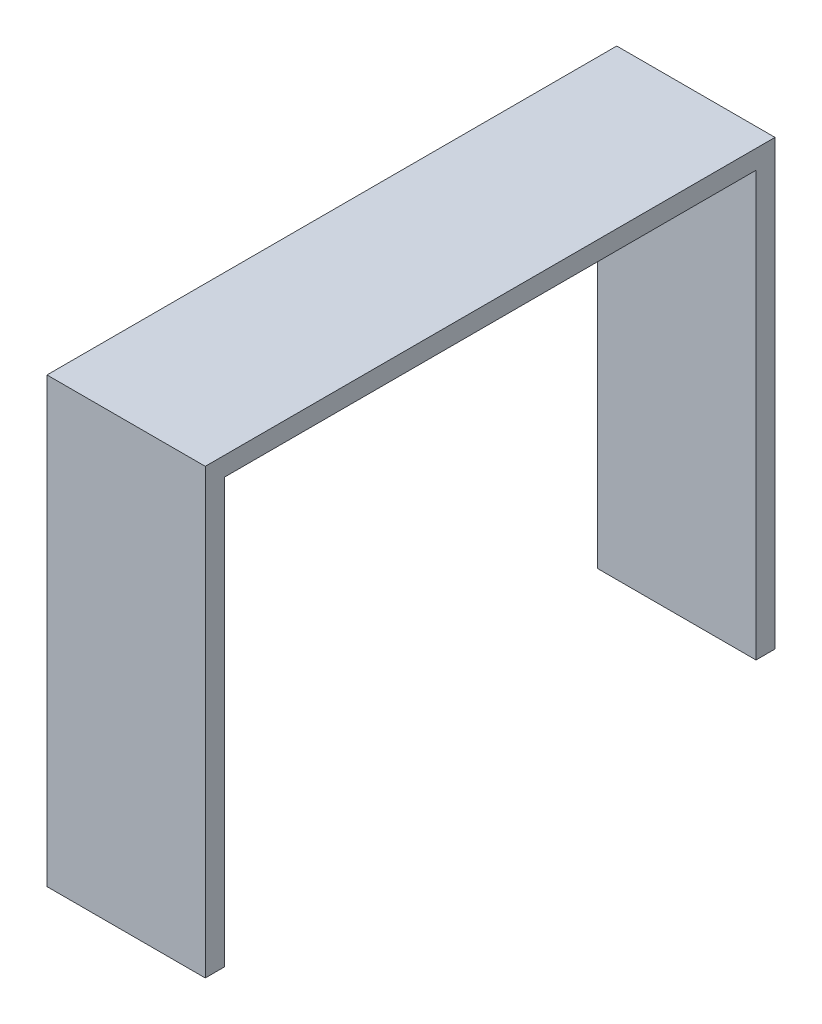
ISO-10303-21;
HEADER;
FILE_DESCRIPTION(('STEP AP214'),'2;1');
FILE_NAME('part.step','',(''),(''),'','','');
FILE_SCHEMA(('AUTOMOTIVE_DESIGN { 1 0 10303 214 1 1 1 1 }'));
ENDSEC;
DATA;
#1=APPLICATION_CONTEXT('core data for automotive mechanical design processes');
#2=APPLICATION_PROTOCOL_DEFINITION('international standard','automotive_design',2000,#1);
#3=PRODUCT_CONTEXT('',#1,'mechanical');
#4=PRODUCT('Part','Part','',(#3));
#5=PRODUCT_RELATED_PRODUCT_CATEGORY('part','',(#4));
#6=PRODUCT_DEFINITION_FORMATION('','',#4);
#7=PRODUCT_DEFINITION_CONTEXT('part definition',#1,'design');
#8=PRODUCT_DEFINITION('design','',#6,#7);
#9=PRODUCT_DEFINITION_SHAPE('','',#8);
#10=(LENGTH_UNIT() NAMED_UNIT(*) SI_UNIT(.MILLI.,.METRE.));
#11=(NAMED_UNIT(*) PLANE_ANGLE_UNIT() SI_UNIT($,.RADIAN.));
#12=(NAMED_UNIT(*) SI_UNIT($,.STERADIAN.) SOLID_ANGLE_UNIT());
#13=UNCERTAINTY_MEASURE_WITH_UNIT(LENGTH_MEASURE(1.E-05),#10,'distance_accuracy_value','');
#14=(GEOMETRIC_REPRESENTATION_CONTEXT(3) GLOBAL_UNCERTAINTY_ASSIGNED_CONTEXT((#13)) GLOBAL_UNIT_ASSIGNED_CONTEXT((#10,
#11,#12)) REPRESENTATION_CONTEXT('',''));
#15=CARTESIAN_POINT('',(0.,0.,0.));
#16=DIRECTION('',(0.,0.,1.));
#17=DIRECTION('',(1.,0.,0.));
#18=AXIS2_PLACEMENT_3D('',#15,#16,#17);
#19=CARTESIAN_POINT('',(23.7086266927991,74.,-5.));
#20=DIRECTION('',(1.,0.,0.));
#21=DIRECTION('',(0.,0.,-1.));
#22=AXIS2_PLACEMENT_3D('',#19,#20,#21);
#23=PLANE('',#22);
#24=DIRECTION('',(0.,0.,1.));
#25=VECTOR('',#24,1.);
#26=CARTESIAN_POINT('',(23.7086266927991,4.,-5.));
#27=LINE('',#26,#25);
#28=CARTESIAN_POINT('',(23.7086266927991,4.,-8.00000000000001));
#29=VERTEX_POINT('',#28);
#30=CARTESIAN_POINT('',(23.7086266927991,4.,-5.));
#31=VERTEX_POINT('',#30);
#32=EDGE_CURVE('E11',#29,#31,#27,.T.);
#33=ORIENTED_EDGE('',*,*,#32,.T.);
#34=DIRECTION('',(0.,-1.,0.));
#35=VECTOR('',#34,1.);
#36=CARTESIAN_POINT('',(23.7086266927991,74.,-5.));
#37=LINE('',#36,#35);
#38=CARTESIAN_POINT('',(23.7086266927991,74.,-5.));
#39=VERTEX_POINT('',#38);
#40=EDGE_CURVE('E160',#39,#31,#37,.T.);
#41=ORIENTED_EDGE('',*,*,#40,.F.);
#42=DIRECTION('',(0.,0.,1.));
#43=VECTOR('',#42,1.);
#44=CARTESIAN_POINT('',(23.7086266927991,74.,-5.));
#45=LINE('',#44,#43);
#46=CARTESIAN_POINT('',(23.7086266927991,74.,-95.));
#47=VERTEX_POINT('',#46);
#48=EDGE_CURVE('E43',#47,#39,#45,.T.);
#49=ORIENTED_EDGE('',*,*,#48,.F.);
#50=DIRECTION('',(0.,-1.,0.));
#51=VECTOR('',#50,1.);
#52=CARTESIAN_POINT('',(23.7086266927991,74.,-95.));
#53=LINE('',#52,#51);
#54=CARTESIAN_POINT('',(23.7086266927991,4.,-95.));
#55=VERTEX_POINT('',#54);
#56=EDGE_CURVE('E133',#47,#55,#53,.T.);
#57=ORIENTED_EDGE('',*,*,#56,.T.);
#58=DIRECTION('',(0.,0.,1.));
#59=VECTOR('',#58,1.);
#60=CARTESIAN_POINT('',(23.7086266927991,4.,-95.));
#61=LINE('',#60,#59);
#62=CARTESIAN_POINT('',(23.7086266927991,4.,-92.));
#63=VERTEX_POINT('',#62);
#64=EDGE_CURVE('E142',#55,#63,#61,.T.);
#65=ORIENTED_EDGE('',*,*,#64,.T.);
#66=DIRECTION('',(0.,-1.,0.));
#67=VECTOR('',#66,1.);
#68=CARTESIAN_POINT('',(23.7086266927991,74.,-92.));
#69=LINE('',#68,#67);
#70=CARTESIAN_POINT('',(23.7086266927991,71.,-92.));
#71=VERTEX_POINT('',#70);
#72=EDGE_CURVE('E150',#71,#63,#69,.T.);
#73=ORIENTED_EDGE('',*,*,#72,.F.);
#74=DIRECTION('',(0.,0.,-1.));
#75=VECTOR('',#74,1.);
#76=CARTESIAN_POINT('',(23.7086266927992,71.,-4.998));
#77=LINE('',#76,#75);
#78=CARTESIAN_POINT('',(23.7086266927992,71.,-8.00000000000001));
#79=VERTEX_POINT('',#78);
#80=EDGE_CURVE('E154',#79,#71,#77,.T.);
#81=ORIENTED_EDGE('',*,*,#80,.F.);
#82=DIRECTION('',(0.,-1.,0.));
#83=VECTOR('',#82,1.);
#84=CARTESIAN_POINT('',(23.7086266927991,74.,-8.00000000000001));
#85=LINE('',#84,#83);
#86=EDGE_CURVE('E85',#79,#29,#85,.T.);
#87=ORIENTED_EDGE('',*,*,#86,.T.);
#88=EDGE_LOOP('',(#33,#41,#49,#57,#65,#73,#81,#87));
#89=FACE_BOUND('',#88,.T.);
#90=ADVANCED_FACE('F39',(#89),#23,.F.);
#91=CARTESIAN_POINT('',(23.7086266927991,74.,-5.));
#92=DIRECTION('',(0.,0.,-1.));
#93=DIRECTION('',(-1.,0.,0.));
#94=AXIS2_PLACEMENT_3D('',#91,#92,#93);
#95=PLANE('',#94);
#96=DIRECTION('',(1.,0.,0.));
#97=VECTOR('',#96,1.);
#98=CARTESIAN_POINT('',(23.7086266927991,4.,-5.));
#99=LINE('',#98,#97);
#100=CARTESIAN_POINT('',(48.7086266927992,4.,-5.));
#101=VERTEX_POINT('',#100);
#102=EDGE_CURVE('E48',#31,#101,#99,.T.);
#103=ORIENTED_EDGE('',*,*,#102,.T.);
#104=DIRECTION('',(0.,-1.,0.));
#105=VECTOR('',#104,1.);
#106=CARTESIAN_POINT('',(48.7086266927992,74.,-5.));
#107=LINE('',#106,#105);
#108=CARTESIAN_POINT('',(48.7086266927992,74.,-5.));
#109=VERTEX_POINT('',#108);
#110=EDGE_CURVE('E162',#109,#101,#107,.T.);
#111=ORIENTED_EDGE('',*,*,#110,.F.);
#112=DIRECTION('',(1.,0.,0.));
#113=VECTOR('',#112,1.);
#114=CARTESIAN_POINT('',(23.7086266927991,74.,-5.));
#115=LINE('',#114,#113);
#116=EDGE_CURVE('E78',#39,#109,#115,.T.);
#117=ORIENTED_EDGE('',*,*,#116,.F.);
#118=ORIENTED_EDGE('',*,*,#40,.T.);
#119=EDGE_LOOP('',(#103,#111,#117,#118));
#120=FACE_BOUND('',#119,.T.);
#121=ADVANCED_FACE('F172',(#120),#95,.F.);
#122=CARTESIAN_POINT('',(48.7086266927992,74.,-5.));
#123=DIRECTION('',(-1.,0.,0.));
#124=DIRECTION('',(0.,0.,1.));
#125=AXIS2_PLACEMENT_3D('',#122,#123,#124);
#126=PLANE('',#125);
#127=DIRECTION('',(0.,0.,-1.));
#128=VECTOR('',#127,1.);
#129=CARTESIAN_POINT('',(48.7086266927992,4.,-5.));
#130=LINE('',#129,#128);
#131=CARTESIAN_POINT('',(48.7086266927992,4.,-8.00000000000002));
#132=VERTEX_POINT('',#131);
#133=EDGE_CURVE('E169',#101,#132,#130,.T.);
#134=ORIENTED_EDGE('',*,*,#133,.T.);
#135=DIRECTION('',(0.,-1.,0.));
#136=VECTOR('',#135,1.);
#137=CARTESIAN_POINT('',(48.7086266927992,74.,-8.00000000000002));
#138=LINE('',#137,#136);
#139=CARTESIAN_POINT('',(48.7086266927992,71.,-8.00000000000002));
#140=VERTEX_POINT('',#139);
#141=EDGE_CURVE('E164',#140,#132,#138,.T.);
#142=ORIENTED_EDGE('',*,*,#141,.F.);
#143=DIRECTION('',(0.,0.,-1.));
#144=VECTOR('',#143,1.);
#145=CARTESIAN_POINT('',(48.7086266927992,71.,-4.998));
#146=LINE('',#145,#144);
#147=CARTESIAN_POINT('',(48.7086266927992,71.,-92.));
#148=VERTEX_POINT('',#147);
#149=EDGE_CURVE('E56',#140,#148,#146,.T.);
#150=ORIENTED_EDGE('',*,*,#149,.T.);
#151=DIRECTION('',(0.,-1.,0.));
#152=VECTOR('',#151,1.);
#153=CARTESIAN_POINT('',(48.7086266927992,74.,-92.));
#154=LINE('',#153,#152);
#155=CARTESIAN_POINT('',(48.7086266927992,4.,-92.));
#156=VERTEX_POINT('',#155);
#157=EDGE_CURVE('E132',#148,#156,#154,.T.);
#158=ORIENTED_EDGE('',*,*,#157,.T.);
#159=DIRECTION('',(0.,0.,-1.));
#160=VECTOR('',#159,1.);
#161=CARTESIAN_POINT('',(48.7086266927992,4.,-95.));
#162=LINE('',#161,#160);
#163=CARTESIAN_POINT('',(48.7086266927992,4.,-95.));
#164=VERTEX_POINT('',#163);
#165=EDGE_CURVE('E129',#156,#164,#162,.T.);
#166=ORIENTED_EDGE('',*,*,#165,.T.);
#167=DIRECTION('',(0.,-1.,0.));
#168=VECTOR('',#167,1.);
#169=CARTESIAN_POINT('',(48.7086266927992,74.,-95.));
#170=LINE('',#169,#168);
#171=CARTESIAN_POINT('',(48.7086266927992,74.,-95.));
#172=VERTEX_POINT('',#171);
#173=EDGE_CURVE('E125',#172,#164,#170,.T.);
#174=ORIENTED_EDGE('',*,*,#173,.F.);
#175=DIRECTION('',(0.,0.,-1.));
#176=VECTOR('',#175,1.);
#177=CARTESIAN_POINT('',(48.7086266927992,74.,-5.));
#178=LINE('',#177,#176);
#179=EDGE_CURVE('E116',#109,#172,#178,.T.);
#180=ORIENTED_EDGE('',*,*,#179,.F.);
#181=ORIENTED_EDGE('',*,*,#110,.T.);
#182=EDGE_LOOP('',(#134,#142,#150,#158,#166,#174,#180,#181));
#183=FACE_BOUND('',#182,.T.);
#184=ADVANCED_FACE('F127',(#183),#126,.F.);
#185=CARTESIAN_POINT('',(23.7086266927991,74.,-8.00000000000001));
#186=DIRECTION('',(0.,0.,1.));
#187=DIRECTION('',(1.,0.,0.));
#188=AXIS2_PLACEMENT_3D('',#185,#186,#187);
#189=PLANE('',#188);
#190=ORIENTED_EDGE('',*,*,#86,.F.);
#191=DIRECTION('',(1.,0.,0.));
#192=VECTOR('',#191,1.);
#193=CARTESIAN_POINT('',(23.7086266927992,71.,-8.00000000000001));
#194=LINE('',#193,#192);
#195=EDGE_CURVE('E157',#79,#140,#194,.T.);
#196=ORIENTED_EDGE('',*,*,#195,.T.);
#197=ORIENTED_EDGE('',*,*,#141,.T.);
#198=DIRECTION('',(-1.,0.,0.));
#199=VECTOR('',#198,1.);
#200=CARTESIAN_POINT('',(23.7086266927991,4.,-8.00000000000001));
#201=LINE('',#200,#199);
#202=EDGE_CURVE('E167',#132,#29,#201,.T.);
#203=ORIENTED_EDGE('',*,*,#202,.T.);
#204=EDGE_LOOP('',(#190,#196,#197,#203));
#205=FACE_BOUND('',#204,.T.);
#206=ADVANCED_FACE('F177',(#205),#189,.F.);
#207=CARTESIAN_POINT('',(0.,74.,0.));
#208=DIRECTION('',(0.,-1.,0.));
#209=DIRECTION('',(0.,0.,-1.));
#210=AXIS2_PLACEMENT_3D('',#207,#208,#209);
#211=PLANE('',#210);
#212=ORIENTED_EDGE('',*,*,#48,.T.);
#213=ORIENTED_EDGE('',*,*,#116,.T.);
#214=ORIENTED_EDGE('',*,*,#179,.T.);
#215=DIRECTION('',(-1.,0.,0.));
#216=VECTOR('',#215,1.);
#217=CARTESIAN_POINT('',(23.7086266927991,74.,-95.));
#218=LINE('',#217,#216);
#219=EDGE_CURVE('E119',#172,#47,#218,.T.);
#220=ORIENTED_EDGE('',*,*,#219,.T.);
#221=EDGE_LOOP('',(#212,#213,#214,#220));
#222=FACE_BOUND('',#221,.T.);
#223=ADVANCED_FACE('F41',(#222),#211,.F.);
#224=CARTESIAN_POINT('',(0.,4.,0.));
#225=DIRECTION('',(0.,-1.,0.));
#226=DIRECTION('',(0.,0.,-1.));
#227=AXIS2_PLACEMENT_3D('',#224,#225,#226);
#228=PLANE('',#227);
#229=ORIENTED_EDGE('',*,*,#32,.F.);
#230=ORIENTED_EDGE('',*,*,#202,.F.);
#231=ORIENTED_EDGE('',*,*,#133,.F.);
#232=ORIENTED_EDGE('',*,*,#102,.F.);
#233=EDGE_LOOP('',(#229,#230,#231,#232));
#234=FACE_BOUND('',#233,.T.);
#235=ADVANCED_FACE('F175',(#234),#228,.T.);
#236=CARTESIAN_POINT('',(23.7086266927992,71.,-4.998));
#237=DIRECTION('',(0.,1.,0.));
#238=DIRECTION('',(0.,0.,1.));
#239=AXIS2_PLACEMENT_3D('',#236,#237,#238);
#240=PLANE('',#239);
#241=ORIENTED_EDGE('',*,*,#195,.F.);
#242=ORIENTED_EDGE('',*,*,#80,.T.);
#243=DIRECTION('',(1.,0.,0.));
#244=VECTOR('',#243,1.);
#245=CARTESIAN_POINT('',(23.7086266927992,71.,-92.));
#246=LINE('',#245,#244);
#247=EDGE_CURVE('E152',#71,#148,#246,.T.);
#248=ORIENTED_EDGE('',*,*,#247,.T.);
#249=ORIENTED_EDGE('',*,*,#149,.F.);
#250=EDGE_LOOP('',(#241,#242,#248,#249));
#251=FACE_BOUND('',#250,.T.);
#252=ADVANCED_FACE('F178',(#251),#240,.F.);
#253=CARTESIAN_POINT('',(23.7086266927991,74.,-92.));
#254=DIRECTION('',(0.,0.,-1.));
#255=DIRECTION('',(-1.,0.,0.));
#256=AXIS2_PLACEMENT_3D('',#253,#254,#255);
#257=PLANE('',#256);
#258=ORIENTED_EDGE('',*,*,#247,.F.);
#259=ORIENTED_EDGE('',*,*,#72,.T.);
#260=DIRECTION('',(1.,0.,0.));
#261=VECTOR('',#260,1.);
#262=CARTESIAN_POINT('',(23.7086266927991,4.,-92.));
#263=LINE('',#262,#261);
#264=EDGE_CURVE('E145',#63,#156,#263,.T.);
#265=ORIENTED_EDGE('',*,*,#264,.T.);
#266=ORIENTED_EDGE('',*,*,#157,.F.);
#267=EDGE_LOOP('',(#258,#259,#265,#266));
#268=FACE_BOUND('',#267,.T.);
#269=ADVANCED_FACE('F181',(#268),#257,.F.);
#270=CARTESIAN_POINT('',(23.7086266927991,74.,-95.));
#271=DIRECTION('',(0.,0.,1.));
#272=DIRECTION('',(1.,0.,0.));
#273=AXIS2_PLACEMENT_3D('',#270,#271,#272);
#274=PLANE('',#273);
#275=DIRECTION('',(-1.,0.,0.));
#276=VECTOR('',#275,1.);
#277=CARTESIAN_POINT('',(23.7086266927991,4.,-95.));
#278=LINE('',#277,#276);
#279=EDGE_CURVE('E137',#164,#55,#278,.T.);
#280=ORIENTED_EDGE('',*,*,#279,.T.);
#281=ORIENTED_EDGE('',*,*,#56,.F.);
#282=ORIENTED_EDGE('',*,*,#219,.F.);
#283=ORIENTED_EDGE('',*,*,#173,.T.);
#284=EDGE_LOOP('',(#280,#281,#282,#283));
#285=FACE_BOUND('',#284,.T.);
#286=ADVANCED_FACE('F135',(#285),#274,.F.);
#287=CARTESIAN_POINT('',(0.,4.,0.));
#288=DIRECTION('',(0.,1.,0.));
#289=DIRECTION('',(0.,0.,1.));
#290=AXIS2_PLACEMENT_3D('',#287,#288,#289);
#291=PLANE('',#290);
#292=ORIENTED_EDGE('',*,*,#64,.F.);
#293=ORIENTED_EDGE('',*,*,#279,.F.);
#294=ORIENTED_EDGE('',*,*,#165,.F.);
#295=ORIENTED_EDGE('',*,*,#264,.F.);
#296=EDGE_LOOP('',(#292,#293,#294,#295));
#297=FACE_BOUND('',#296,.T.);
#298=ADVANCED_FACE('F185',(#297),#291,.F.);
#299=CLOSED_SHELL('',(#90,#121,#184,#206,#223,#235,#252,#269,#286,#298));
#300=MANIFOLD_SOLID_BREP('B2',#299);
#301=ADVANCED_BREP_SHAPE_REPRESENTATION('',(#18,#300),#14);
#302=SHAPE_DEFINITION_REPRESENTATION(#9,#301);
ENDSEC;
END-ISO-10303-21;
